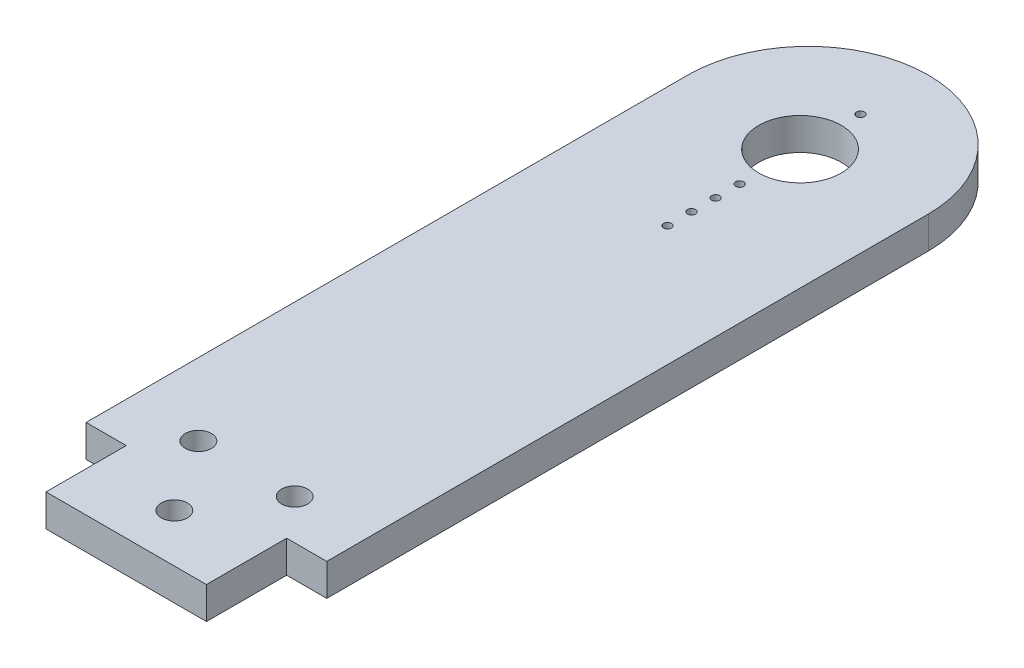
ISO-10303-21;
HEADER;
FILE_DESCRIPTION(('STEP AP214'),'2;1');
FILE_NAME('part.step','',(''),(''),'','','');
FILE_SCHEMA(('AUTOMOTIVE_DESIGN { 1 0 10303 214 1 1 1 1 }'));
ENDSEC;
DATA;
#1=APPLICATION_CONTEXT('core data for automotive mechanical design processes');
#2=APPLICATION_PROTOCOL_DEFINITION('international standard','automotive_design',2000,#1);
#3=PRODUCT_CONTEXT('',#1,'mechanical');
#4=PRODUCT('Part','Part','',(#3));
#5=PRODUCT_RELATED_PRODUCT_CATEGORY('part','',(#4));
#6=PRODUCT_DEFINITION_FORMATION('','',#4);
#7=PRODUCT_DEFINITION_CONTEXT('part definition',#1,'design');
#8=PRODUCT_DEFINITION('design','',#6,#7);
#9=PRODUCT_DEFINITION_SHAPE('','',#8);
#10=(LENGTH_UNIT() NAMED_UNIT(*) SI_UNIT(.MILLI.,.METRE.));
#11=(NAMED_UNIT(*) PLANE_ANGLE_UNIT() SI_UNIT($,.RADIAN.));
#12=(NAMED_UNIT(*) SI_UNIT($,.STERADIAN.) SOLID_ANGLE_UNIT());
#13=UNCERTAINTY_MEASURE_WITH_UNIT(LENGTH_MEASURE(1.E-05),#10,'distance_accuracy_value','');
#14=(GEOMETRIC_REPRESENTATION_CONTEXT(3) GLOBAL_UNCERTAINTY_ASSIGNED_CONTEXT((#13)) GLOBAL_UNIT_ASSIGNED_CONTEXT((#10,
#11,#12)) REPRESENTATION_CONTEXT('',''));
#15=CARTESIAN_POINT('',(0.,0.,0.));
#16=DIRECTION('',(0.,0.,1.));
#17=DIRECTION('',(1.,0.,0.));
#18=AXIS2_PLACEMENT_3D('',#15,#16,#17);
#19=CARTESIAN_POINT('',(0.,4.,0.));
#20=DIRECTION('',(0.,-1.,0.));
#21=DIRECTION('',(0.,0.,-1.));
#22=AXIS2_PLACEMENT_3D('',#19,#20,#21);
#23=PLANE('',#22);
#24=CARTESIAN_POINT('',(0.,4.,-91.53));
#25=DIRECTION('',(0.,1.,0.));
#26=DIRECTION('',(0.,0.,1.));
#27=AXIS2_PLACEMENT_3D('',#24,#25,#26);
#28=CIRCLE('',#27,0.5);
#29=CARTESIAN_POINT('',(0.,4.,-91.03));
#30=VERTEX_POINT('',#29);
#31=EDGE_CURVE('E319',#30,#30,#28,.T.);
#32=ORIENTED_EDGE('',*,*,#31,.F.);
#33=EDGE_LOOP('',(#32));
#34=FACE_BOUND('',#33,.T.);
#35=CARTESIAN_POINT('',(0.,4.,-67.47));
#36=DIRECTION('',(0.,1.,0.));
#37=DIRECTION('',(0.,0.,1.));
#38=AXIS2_PLACEMENT_3D('',#35,#36,#37);
#39=CIRCLE('',#38,0.5);
#40=CARTESIAN_POINT('',(0.,4.,-66.97));
#41=VERTEX_POINT('',#40);
#42=EDGE_CURVE('E321',#41,#41,#39,.T.);
#43=ORIENTED_EDGE('',*,*,#42,.F.);
#44=EDGE_LOOP('',(#43));
#45=FACE_BOUND('',#44,.T.);
#46=CARTESIAN_POINT('',(0.,4.,-70.47));
#47=DIRECTION('',(0.,1.,0.));
#48=DIRECTION('',(0.,0.,1.));
#49=AXIS2_PLACEMENT_3D('',#46,#47,#48);
#50=CIRCLE('',#49,0.5);
#51=CARTESIAN_POINT('',(0.,4.,-69.97));
#52=VERTEX_POINT('',#51);
#53=EDGE_CURVE('E327',#52,#52,#50,.T.);
#54=ORIENTED_EDGE('',*,*,#53,.F.);
#55=EDGE_LOOP('',(#54));
#56=FACE_BOUND('',#55,.T.);
#57=CARTESIAN_POINT('',(0.,4.,-73.47));
#58=DIRECTION('',(0.,1.,0.));
#59=DIRECTION('',(0.,0.,1.));
#60=AXIS2_PLACEMENT_3D('',#57,#58,#59);
#61=CIRCLE('',#60,0.5);
#62=CARTESIAN_POINT('',(0.,4.,-72.97));
#63=VERTEX_POINT('',#62);
#64=EDGE_CURVE('E215',#63,#63,#61,.T.);
#65=ORIENTED_EDGE('',*,*,#64,.F.);
#66=EDGE_LOOP('',(#65));
#67=FACE_BOUND('',#66,.T.);
#68=CARTESIAN_POINT('',(0.,4.,-76.47));
#69=DIRECTION('',(0.,1.,0.));
#70=DIRECTION('',(0.,0.,1.));
#71=AXIS2_PLACEMENT_3D('',#68,#69,#70);
#72=CIRCLE('',#71,0.5);
#73=CARTESIAN_POINT('',(0.,4.,-75.97));
#74=VERTEX_POINT('',#73);
#75=EDGE_CURVE('E207',#74,#74,#72,.T.);
#76=ORIENTED_EDGE('',*,*,#75,.F.);
#77=EDGE_LOOP('',(#76));
#78=FACE_BOUND('',#77,.T.);
#79=CARTESIAN_POINT('',(6.,4.,-15.));
#80=DIRECTION('',(0.,1.,0.));
#81=DIRECTION('',(0.,0.,-1.));
#82=AXIS2_PLACEMENT_3D('',#79,#80,#81);
#83=CIRCLE('',#82,1.625);
#84=CARTESIAN_POINT('',(6.,4.,-16.625));
#85=VERTEX_POINT('',#84);
#86=EDGE_CURVE('E221',#85,#85,#83,.T.);
#87=ORIENTED_EDGE('',*,*,#86,.F.);
#88=EDGE_LOOP('',(#87));
#89=FACE_BOUND('',#88,.T.);
#90=CARTESIAN_POINT('',(-6.,4.,-15.));
#91=DIRECTION('',(0.,1.,0.));
#92=DIRECTION('',(0.,0.,1.));
#93=AXIS2_PLACEMENT_3D('',#90,#91,#92);
#94=CIRCLE('',#93,1.625);
#95=CARTESIAN_POINT('',(-6.,4.,-13.375));
#96=VERTEX_POINT('',#95);
#97=EDGE_CURVE('E160',#96,#96,#94,.T.);
#98=ORIENTED_EDGE('',*,*,#97,.F.);
#99=EDGE_LOOP('',(#98));
#100=FACE_BOUND('',#99,.T.);
#101=DIRECTION('',(0.,0.,-1.));
#102=VECTOR('',#101,1.);
#103=CARTESIAN_POINT('',(15.,4.,-10.));
#104=LINE('',#103,#102);
#105=CARTESIAN_POINT('',(15.,4.,-10.));
#106=VERTEX_POINT('',#105);
#107=CARTESIAN_POINT('',(15.,4.,-85.));
#108=VERTEX_POINT('',#107);
#109=EDGE_CURVE('E112',#106,#108,#104,.T.);
#110=ORIENTED_EDGE('',*,*,#109,.T.);
#111=CARTESIAN_POINT('',(0.,4.,-85.));
#112=DIRECTION('',(0.,-1.,0.));
#113=DIRECTION('',(0.,0.,-1.));
#114=AXIS2_PLACEMENT_3D('',#111,#112,#113);
#115=CIRCLE('',#114,15.);
#116=CARTESIAN_POINT('',(0.,4.,-100.));
#117=VERTEX_POINT('',#116);
#118=EDGE_CURVE('E44',#108,#117,#115,.F.);
#119=ORIENTED_EDGE('',*,*,#118,.T.);
#120=CARTESIAN_POINT('',(0.,4.,-85.));
#121=DIRECTION('',(0.,-1.,0.));
#122=DIRECTION('',(0.,0.,-1.));
#123=AXIS2_PLACEMENT_3D('',#120,#121,#122);
#124=CIRCLE('',#123,15.);
#125=CARTESIAN_POINT('',(-15.,4.,-85.));
#126=VERTEX_POINT('',#125);
#127=EDGE_CURVE('E51',#117,#126,#124,.F.);
#128=ORIENTED_EDGE('',*,*,#127,.T.);
#129=DIRECTION('',(0.,0.,1.));
#130=VECTOR('',#129,1.);
#131=CARTESIAN_POINT('',(-15.,4.,-100.));
#132=LINE('',#131,#130);
#133=CARTESIAN_POINT('',(-15.,4.,-10.));
#134=VERTEX_POINT('',#133);
#135=EDGE_CURVE('E148',#126,#134,#132,.T.);
#136=ORIENTED_EDGE('',*,*,#135,.T.);
#137=DIRECTION('',(1.,0.,0.));
#138=VECTOR('',#137,1.);
#139=CARTESIAN_POINT('',(-15.,4.,-10.));
#140=LINE('',#139,#138);
#141=CARTESIAN_POINT('',(-10.,4.,-10.));
#142=VERTEX_POINT('',#141);
#143=EDGE_CURVE('E150',#134,#142,#140,.T.);
#144=ORIENTED_EDGE('',*,*,#143,.T.);
#145=DIRECTION('',(0.,0.,1.));
#146=VECTOR('',#145,1.);
#147=CARTESIAN_POINT('',(-10.,4.,-10.));
#148=LINE('',#147,#146);
#149=CARTESIAN_POINT('',(-10.,4.,0.));
#150=VERTEX_POINT('',#149);
#151=EDGE_CURVE('E154',#142,#150,#148,.T.);
#152=ORIENTED_EDGE('',*,*,#151,.T.);
#153=DIRECTION('',(1.,0.,0.));
#154=VECTOR('',#153,1.);
#155=CARTESIAN_POINT('',(-10.,4.,0.));
#156=LINE('',#155,#154);
#157=CARTESIAN_POINT('',(10.,4.,0.));
#158=VERTEX_POINT('',#157);
#159=EDGE_CURVE('E118',#150,#158,#156,.T.);
#160=ORIENTED_EDGE('',*,*,#159,.T.);
#161=DIRECTION('',(0.,0.,-1.));
#162=VECTOR('',#161,1.);
#163=CARTESIAN_POINT('',(10.,4.,0.));
#164=LINE('',#163,#162);
#165=CARTESIAN_POINT('',(10.,4.,-10.));
#166=VERTEX_POINT('',#165);
#167=EDGE_CURVE('E113',#158,#166,#164,.T.);
#168=ORIENTED_EDGE('',*,*,#167,.T.);
#169=DIRECTION('',(1.,0.,0.));
#170=VECTOR('',#169,1.);
#171=CARTESIAN_POINT('',(10.,4.,-10.));
#172=LINE('',#171,#170);
#173=EDGE_CURVE('E103',#166,#106,#172,.T.);
#174=ORIENTED_EDGE('',*,*,#173,.T.);
#175=EDGE_LOOP('',(#110,#119,#128,#136,#144,#152,#160,#168,#174));
#176=FACE_BOUND('',#175,.T.);
#177=CARTESIAN_POINT('',(0.,4.,-6.));
#178=DIRECTION('',(0.,1.,0.));
#179=DIRECTION('',(0.,0.,1.));
#180=AXIS2_PLACEMENT_3D('',#177,#178,#179);
#181=CIRCLE('',#180,1.625);
#182=CARTESIAN_POINT('',(0.,4.,-4.375));
#183=VERTEX_POINT('',#182);
#184=EDGE_CURVE('E227',#183,#183,#181,.T.);
#185=ORIENTED_EDGE('',*,*,#184,.F.);
#186=EDGE_LOOP('',(#185));
#187=FACE_BOUND('',#186,.T.);
#188=CARTESIAN_POINT('',(0.,4.,-84.));
#189=DIRECTION('',(0.,1.,0.));
#190=DIRECTION('',(0.,0.,1.));
#191=AXIS2_PLACEMENT_3D('',#188,#189,#190);
#192=CIRCLE('',#191,5.15);
#193=CARTESIAN_POINT('',(0.,4.,-78.85));
#194=VERTEX_POINT('',#193);
#195=EDGE_CURVE('E204',#194,#194,#192,.T.);
#196=ORIENTED_EDGE('',*,*,#195,.F.);
#197=EDGE_LOOP('',(#196));
#198=FACE_BOUND('',#197,.T.);
#199=ADVANCED_FACE('F35',(#34,#45,#56,#67,#78,#89,#100,#176,#187,#198),#23,.F.);
#200=CARTESIAN_POINT('',(0.,0.,0.));
#201=DIRECTION('',(0.,-1.,0.));
#202=DIRECTION('',(0.,0.,-1.));
#203=AXIS2_PLACEMENT_3D('',#200,#201,#202);
#204=PLANE('',#203);
#205=CARTESIAN_POINT('',(0.,0.,-91.53));
#206=DIRECTION('',(0.,1.,0.));
#207=DIRECTION('',(0.,0.,1.));
#208=AXIS2_PLACEMENT_3D('',#205,#206,#207);
#209=CIRCLE('',#208,0.5);
#210=CARTESIAN_POINT('',(0.,0.,-91.03));
#211=VERTEX_POINT('',#210);
#212=EDGE_CURVE('E317',#211,#211,#209,.T.);
#213=ORIENTED_EDGE('',*,*,#212,.T.);
#214=EDGE_LOOP('',(#213));
#215=FACE_BOUND('',#214,.T.);
#216=CARTESIAN_POINT('',(0.,0.,-67.47));
#217=DIRECTION('',(0.,1.,0.));
#218=DIRECTION('',(0.,0.,1.));
#219=AXIS2_PLACEMENT_3D('',#216,#217,#218);
#220=CIRCLE('',#219,0.5);
#221=CARTESIAN_POINT('',(0.,0.,-66.97));
#222=VERTEX_POINT('',#221);
#223=EDGE_CURVE('E324',#222,#222,#220,.T.);
#224=ORIENTED_EDGE('',*,*,#223,.T.);
#225=EDGE_LOOP('',(#224));
#226=FACE_BOUND('',#225,.T.);
#227=CARTESIAN_POINT('',(0.,0.,-70.47));
#228=DIRECTION('',(0.,1.,0.));
#229=DIRECTION('',(0.,0.,1.));
#230=AXIS2_PLACEMENT_3D('',#227,#228,#229);
#231=CIRCLE('',#230,0.5);
#232=CARTESIAN_POINT('',(0.,0.,-69.97));
#233=VERTEX_POINT('',#232);
#234=EDGE_CURVE('E330',#233,#233,#231,.T.);
#235=ORIENTED_EDGE('',*,*,#234,.T.);
#236=EDGE_LOOP('',(#235));
#237=FACE_BOUND('',#236,.T.);
#238=CARTESIAN_POINT('',(0.,0.,-73.47));
#239=DIRECTION('',(0.,1.,0.));
#240=DIRECTION('',(0.,0.,1.));
#241=AXIS2_PLACEMENT_3D('',#238,#239,#240);
#242=CIRCLE('',#241,0.5);
#243=CARTESIAN_POINT('',(0.,0.,-72.97));
#244=VERTEX_POINT('',#243);
#245=EDGE_CURVE('E212',#244,#244,#242,.T.);
#246=ORIENTED_EDGE('',*,*,#245,.T.);
#247=EDGE_LOOP('',(#246));
#248=FACE_BOUND('',#247,.T.);
#249=CARTESIAN_POINT('',(0.,0.,-76.47));
#250=DIRECTION('',(0.,1.,0.));
#251=DIRECTION('',(0.,0.,1.));
#252=AXIS2_PLACEMENT_3D('',#249,#250,#251);
#253=CIRCLE('',#252,0.5);
#254=CARTESIAN_POINT('',(0.,0.,-75.97));
#255=VERTEX_POINT('',#254);
#256=EDGE_CURVE('E202',#255,#255,#253,.T.);
#257=ORIENTED_EDGE('',*,*,#256,.T.);
#258=EDGE_LOOP('',(#257));
#259=FACE_BOUND('',#258,.T.);
#260=CARTESIAN_POINT('',(6.,0.,-15.));
#261=DIRECTION('',(0.,1.,0.));
#262=DIRECTION('',(0.,0.,-1.));
#263=AXIS2_PLACEMENT_3D('',#260,#261,#262);
#264=CIRCLE('',#263,1.625);
#265=CARTESIAN_POINT('',(6.,0.,-16.625));
#266=VERTEX_POINT('',#265);
#267=EDGE_CURVE('E219',#266,#266,#264,.T.);
#268=ORIENTED_EDGE('',*,*,#267,.T.);
#269=EDGE_LOOP('',(#268));
#270=FACE_BOUND('',#269,.T.);
#271=CARTESIAN_POINT('',(-6.,0.,-15.));
#272=DIRECTION('',(0.,1.,0.));
#273=DIRECTION('',(0.,0.,1.));
#274=AXIS2_PLACEMENT_3D('',#271,#272,#273);
#275=CIRCLE('',#274,1.625);
#276=CARTESIAN_POINT('',(-6.,0.,-13.375));
#277=VERTEX_POINT('',#276);
#278=EDGE_CURVE('E230',#277,#277,#275,.T.);
#279=ORIENTED_EDGE('',*,*,#278,.T.);
#280=EDGE_LOOP('',(#279));
#281=FACE_BOUND('',#280,.T.);
#282=CARTESIAN_POINT('',(0.,0.,-85.));
#283=DIRECTION('',(0.,-1.,0.));
#284=DIRECTION('',(0.,0.,-1.));
#285=AXIS2_PLACEMENT_3D('',#282,#283,#284);
#286=CIRCLE('',#285,15.);
#287=CARTESIAN_POINT('',(-15.,0.,-85.));
#288=VERTEX_POINT('',#287);
#289=CARTESIAN_POINT('',(0.,0.,-100.));
#290=VERTEX_POINT('',#289);
#291=EDGE_CURVE('E127',#288,#290,#286,.T.);
#292=ORIENTED_EDGE('',*,*,#291,.T.);
#293=CARTESIAN_POINT('',(0.,0.,-85.));
#294=DIRECTION('',(0.,-1.,0.));
#295=DIRECTION('',(0.,0.,-1.));
#296=AXIS2_PLACEMENT_3D('',#293,#294,#295);
#297=CIRCLE('',#296,15.);
#298=CARTESIAN_POINT('',(15.,0.,-85.));
#299=VERTEX_POINT('',#298);
#300=EDGE_CURVE('E129',#290,#299,#297,.T.);
#301=ORIENTED_EDGE('',*,*,#300,.T.);
#302=DIRECTION('',(0.,0.,-1.));
#303=VECTOR('',#302,1.);
#304=CARTESIAN_POINT('',(15.,0.,-10.));
#305=LINE('',#304,#303);
#306=CARTESIAN_POINT('',(15.,0.,-10.));
#307=VERTEX_POINT('',#306);
#308=EDGE_CURVE('E145',#307,#299,#305,.T.);
#309=ORIENTED_EDGE('',*,*,#308,.F.);
#310=DIRECTION('',(1.,0.,0.));
#311=VECTOR('',#310,1.);
#312=CARTESIAN_POINT('',(10.,0.,-10.));
#313=LINE('',#312,#311);
#314=CARTESIAN_POINT('',(10.,0.,-10.));
#315=VERTEX_POINT('',#314);
#316=EDGE_CURVE('E159',#315,#307,#313,.T.);
#317=ORIENTED_EDGE('',*,*,#316,.F.);
#318=DIRECTION('',(0.,0.,-1.));
#319=VECTOR('',#318,1.);
#320=CARTESIAN_POINT('',(10.,0.,0.));
#321=LINE('',#320,#319);
#322=CARTESIAN_POINT('',(10.,0.,0.));
#323=VERTEX_POINT('',#322);
#324=EDGE_CURVE('E126',#323,#315,#321,.T.);
#325=ORIENTED_EDGE('',*,*,#324,.F.);
#326=DIRECTION('',(1.,0.,0.));
#327=VECTOR('',#326,1.);
#328=CARTESIAN_POINT('',(-10.,0.,0.));
#329=LINE('',#328,#327);
#330=CARTESIAN_POINT('',(-10.,0.,0.));
#331=VERTEX_POINT('',#330);
#332=EDGE_CURVE('E122',#331,#323,#329,.T.);
#333=ORIENTED_EDGE('',*,*,#332,.F.);
#334=DIRECTION('',(0.,0.,1.));
#335=VECTOR('',#334,1.);
#336=CARTESIAN_POINT('',(-10.,0.,-10.));
#337=LINE('',#336,#335);
#338=CARTESIAN_POINT('',(-10.,0.,-10.));
#339=VERTEX_POINT('',#338);
#340=EDGE_CURVE('E167',#339,#331,#337,.T.);
#341=ORIENTED_EDGE('',*,*,#340,.F.);
#342=DIRECTION('',(1.,0.,0.));
#343=VECTOR('',#342,1.);
#344=CARTESIAN_POINT('',(-15.,0.,-10.));
#345=LINE('',#344,#343);
#346=CARTESIAN_POINT('',(-15.,0.,-10.));
#347=VERTEX_POINT('',#346);
#348=EDGE_CURVE('E165',#347,#339,#345,.T.);
#349=ORIENTED_EDGE('',*,*,#348,.F.);
#350=DIRECTION('',(0.,0.,1.));
#351=VECTOR('',#350,1.);
#352=CARTESIAN_POINT('',(-15.,0.,-100.));
#353=LINE('',#352,#351);
#354=EDGE_CURVE('E163',#288,#347,#353,.T.);
#355=ORIENTED_EDGE('',*,*,#354,.F.);
#356=EDGE_LOOP('',(#292,#301,#309,#317,#325,#333,#341,#349,#355));
#357=FACE_BOUND('',#356,.T.);
#358=CARTESIAN_POINT('',(0.,0.,-6.));
#359=DIRECTION('',(0.,1.,0.));
#360=DIRECTION('',(0.,0.,1.));
#361=AXIS2_PLACEMENT_3D('',#358,#359,#360);
#362=CIRCLE('',#361,1.625);
#363=CARTESIAN_POINT('',(0.,0.,-4.375));
#364=VERTEX_POINT('',#363);
#365=EDGE_CURVE('E224',#364,#364,#362,.T.);
#366=ORIENTED_EDGE('',*,*,#365,.T.);
#367=EDGE_LOOP('',(#366));
#368=FACE_BOUND('',#367,.T.);
#369=CARTESIAN_POINT('',(0.,0.,-84.));
#370=DIRECTION('',(0.,1.,0.));
#371=DIRECTION('',(0.,0.,1.));
#372=AXIS2_PLACEMENT_3D('',#369,#370,#371);
#373=CIRCLE('',#372,5.15);
#374=CARTESIAN_POINT('',(0.,0.,-78.85));
#375=VERTEX_POINT('',#374);
#376=EDGE_CURVE('E201',#375,#375,#373,.T.);
#377=ORIENTED_EDGE('',*,*,#376,.T.);
#378=EDGE_LOOP('',(#377));
#379=FACE_BOUND('',#378,.T.);
#380=ADVANCED_FACE('F187',(#215,#226,#237,#248,#259,#270,#281,#357,#368,#379),#204,.T.);
#381=CARTESIAN_POINT('',(10.,4.,0.));
#382=DIRECTION('',(-1.,0.,0.));
#383=DIRECTION('',(0.,0.,1.));
#384=AXIS2_PLACEMENT_3D('',#381,#382,#383);
#385=PLANE('',#384);
#386=ORIENTED_EDGE('',*,*,#324,.T.);
#387=DIRECTION('',(0.,-1.,0.));
#388=VECTOR('',#387,1.);
#389=CARTESIAN_POINT('',(10.,4.,-10.));
#390=LINE('',#389,#388);
#391=EDGE_CURVE('E107',#166,#315,#390,.T.);
#392=ORIENTED_EDGE('',*,*,#391,.F.);
#393=ORIENTED_EDGE('',*,*,#167,.F.);
#394=DIRECTION('',(0.,-1.,0.));
#395=VECTOR('',#394,1.);
#396=CARTESIAN_POINT('',(10.,4.,0.));
#397=LINE('',#396,#395);
#398=EDGE_CURVE('E157',#158,#323,#397,.T.);
#399=ORIENTED_EDGE('',*,*,#398,.T.);
#400=EDGE_LOOP('',(#386,#392,#393,#399));
#401=FACE_BOUND('',#400,.T.);
#402=ADVANCED_FACE('F124',(#401),#385,.F.);
#403=CARTESIAN_POINT('',(10.,4.,-10.));
#404=DIRECTION('',(0.,0.,-1.));
#405=DIRECTION('',(-1.,0.,0.));
#406=AXIS2_PLACEMENT_3D('',#403,#404,#405);
#407=PLANE('',#406);
#408=ORIENTED_EDGE('',*,*,#316,.T.);
#409=DIRECTION('',(0.,-1.,0.));
#410=VECTOR('',#409,1.);
#411=CARTESIAN_POINT('',(15.,4.,-10.));
#412=LINE('',#411,#410);
#413=EDGE_CURVE('E110',#106,#307,#412,.T.);
#414=ORIENTED_EDGE('',*,*,#413,.F.);
#415=ORIENTED_EDGE('',*,*,#173,.F.);
#416=ORIENTED_EDGE('',*,*,#391,.T.);
#417=EDGE_LOOP('',(#408,#414,#415,#416));
#418=FACE_BOUND('',#417,.T.);
#419=ADVANCED_FACE('F105',(#418),#407,.F.);
#420=CARTESIAN_POINT('',(15.,4.,-10.));
#421=DIRECTION('',(-1.,0.,0.));
#422=DIRECTION('',(0.,0.,1.));
#423=AXIS2_PLACEMENT_3D('',#420,#421,#422);
#424=PLANE('',#423);
#425=ORIENTED_EDGE('',*,*,#308,.T.);
#426=DIRECTION('',(0.,-1.,0.));
#427=VECTOR('',#426,1.);
#428=CARTESIAN_POINT('',(15.,4.,-85.));
#429=LINE('',#428,#427);
#430=EDGE_CURVE('E136',#299,#108,#429,.F.);
#431=ORIENTED_EDGE('',*,*,#430,.T.);
#432=ORIENTED_EDGE('',*,*,#109,.F.);
#433=ORIENTED_EDGE('',*,*,#413,.T.);
#434=EDGE_LOOP('',(#425,#431,#432,#433));
#435=FACE_BOUND('',#434,.T.);
#436=ADVANCED_FACE('F143',(#435),#424,.F.);
#437=CARTESIAN_POINT('',(-15.,4.,-100.));
#438=DIRECTION('',(1.,0.,0.));
#439=DIRECTION('',(0.,0.,-1.));
#440=AXIS2_PLACEMENT_3D('',#437,#438,#439);
#441=PLANE('',#440);
#442=ORIENTED_EDGE('',*,*,#135,.F.);
#443=DIRECTION('',(0.,-1.,0.));
#444=VECTOR('',#443,1.);
#445=CARTESIAN_POINT('',(-15.,4.,-85.));
#446=LINE('',#445,#444);
#447=EDGE_CURVE('E11',#126,#288,#446,.T.);
#448=ORIENTED_EDGE('',*,*,#447,.T.);
#449=ORIENTED_EDGE('',*,*,#354,.T.);
#450=DIRECTION('',(0.,-1.,0.));
#451=VECTOR('',#450,1.);
#452=CARTESIAN_POINT('',(-15.,4.,-10.));
#453=LINE('',#452,#451);
#454=EDGE_CURVE('E131',#134,#347,#453,.T.);
#455=ORIENTED_EDGE('',*,*,#454,.F.);
#456=EDGE_LOOP('',(#442,#448,#449,#455));
#457=FACE_BOUND('',#456,.T.);
#458=ADVANCED_FACE('F267',(#457),#441,.F.);
#459=CARTESIAN_POINT('',(-15.,4.,-10.));
#460=DIRECTION('',(0.,0.,-1.));
#461=DIRECTION('',(-1.,0.,0.));
#462=AXIS2_PLACEMENT_3D('',#459,#460,#461);
#463=PLANE('',#462);
#464=ORIENTED_EDGE('',*,*,#348,.T.);
#465=DIRECTION('',(0.,-1.,0.));
#466=VECTOR('',#465,1.);
#467=CARTESIAN_POINT('',(-10.,4.,-10.));
#468=LINE('',#467,#466);
#469=EDGE_CURVE('E174',#142,#339,#468,.T.);
#470=ORIENTED_EDGE('',*,*,#469,.F.);
#471=ORIENTED_EDGE('',*,*,#143,.F.);
#472=ORIENTED_EDGE('',*,*,#454,.T.);
#473=EDGE_LOOP('',(#464,#470,#471,#472));
#474=FACE_BOUND('',#473,.T.);
#475=ADVANCED_FACE('F181',(#474),#463,.F.);
#476=CARTESIAN_POINT('',(-10.,4.,-10.));
#477=DIRECTION('',(1.,0.,0.));
#478=DIRECTION('',(0.,0.,-1.));
#479=AXIS2_PLACEMENT_3D('',#476,#477,#478);
#480=PLANE('',#479);
#481=ORIENTED_EDGE('',*,*,#340,.T.);
#482=DIRECTION('',(0.,-1.,0.));
#483=VECTOR('',#482,1.);
#484=CARTESIAN_POINT('',(-10.,4.,0.));
#485=LINE('',#484,#483);
#486=EDGE_CURVE('E171',#150,#331,#485,.T.);
#487=ORIENTED_EDGE('',*,*,#486,.F.);
#488=ORIENTED_EDGE('',*,*,#151,.F.);
#489=ORIENTED_EDGE('',*,*,#469,.T.);
#490=EDGE_LOOP('',(#481,#487,#488,#489));
#491=FACE_BOUND('',#490,.T.);
#492=ADVANCED_FACE('F193',(#491),#480,.F.);
#493=CARTESIAN_POINT('',(-10.,4.,0.));
#494=DIRECTION('',(0.,0.,-1.));
#495=DIRECTION('',(-1.,0.,0.));
#496=AXIS2_PLACEMENT_3D('',#493,#494,#495);
#497=PLANE('',#496);
#498=ORIENTED_EDGE('',*,*,#332,.T.);
#499=ORIENTED_EDGE('',*,*,#398,.F.);
#500=ORIENTED_EDGE('',*,*,#159,.F.);
#501=ORIENTED_EDGE('',*,*,#486,.T.);
#502=EDGE_LOOP('',(#498,#499,#500,#501));
#503=FACE_BOUND('',#502,.T.);
#504=ADVANCED_FACE('F196',(#503),#497,.F.);
#505=CARTESIAN_POINT('',(-6.,4.,-15.));
#506=DIRECTION('',(0.,-1.,0.));
#507=DIRECTION('',(0.,0.,-1.));
#508=AXIS2_PLACEMENT_3D('',#505,#506,#507);
#509=CYLINDRICAL_SURFACE('',#508,1.625);
#510=ORIENTED_EDGE('',*,*,#97,.T.);
#511=EDGE_LOOP('',(#510));
#512=FACE_BOUND('',#511,.T.);
#513=ORIENTED_EDGE('',*,*,#278,.F.);
#514=EDGE_LOOP('',(#513));
#515=FACE_BOUND('',#514,.T.);
#516=ADVANCED_FACE('F239',(#512,#515),#509,.F.);
#517=CARTESIAN_POINT('',(0.,4.,-6.));
#518=DIRECTION('',(0.,-1.,0.));
#519=DIRECTION('',(0.,0.,-1.));
#520=AXIS2_PLACEMENT_3D('',#517,#518,#519);
#521=CYLINDRICAL_SURFACE('',#520,1.625);
#522=ORIENTED_EDGE('',*,*,#184,.T.);
#523=EDGE_LOOP('',(#522));
#524=FACE_BOUND('',#523,.T.);
#525=ORIENTED_EDGE('',*,*,#365,.F.);
#526=EDGE_LOOP('',(#525));
#527=FACE_BOUND('',#526,.T.);
#528=ADVANCED_FACE('F241',(#524,#527),#521,.F.);
#529=CARTESIAN_POINT('',(6.,4.,-15.));
#530=DIRECTION('',(0.,-1.,0.));
#531=DIRECTION('',(0.,0.,-1.));
#532=AXIS2_PLACEMENT_3D('',#529,#530,#531);
#533=CYLINDRICAL_SURFACE('',#532,1.625);
#534=ORIENTED_EDGE('',*,*,#86,.T.);
#535=EDGE_LOOP('',(#534));
#536=FACE_BOUND('',#535,.T.);
#537=ORIENTED_EDGE('',*,*,#267,.F.);
#538=EDGE_LOOP('',(#537));
#539=FACE_BOUND('',#538,.T.);
#540=ADVANCED_FACE('F248',(#536,#539),#533,.F.);
#541=CARTESIAN_POINT('',(0.,4.,-84.));
#542=DIRECTION('',(0.,-1.,0.));
#543=DIRECTION('',(0.,0.,-1.));
#544=AXIS2_PLACEMENT_3D('',#541,#542,#543);
#545=CYLINDRICAL_SURFACE('',#544,5.15);
#546=ORIENTED_EDGE('',*,*,#195,.T.);
#547=EDGE_LOOP('',(#546));
#548=FACE_BOUND('',#547,.T.);
#549=ORIENTED_EDGE('',*,*,#376,.F.);
#550=EDGE_LOOP('',(#549));
#551=FACE_BOUND('',#550,.T.);
#552=ADVANCED_FACE('F284',(#548,#551),#545,.F.);
#553=CARTESIAN_POINT('',(0.,4.,-85.));
#554=DIRECTION('',(0.,-1.,0.));
#555=DIRECTION('',(0.,0.,-1.));
#556=AXIS2_PLACEMENT_3D('',#553,#554,#555);
#557=CYLINDRICAL_SURFACE('',#556,15.);
#558=ORIENTED_EDGE('',*,*,#447,.F.);
#559=ORIENTED_EDGE('',*,*,#127,.F.);
#560=DIRECTION('',(0.,-1.,0.));
#561=VECTOR('',#560,1.);
#562=CARTESIAN_POINT('',(0.,4.,-100.));
#563=LINE('',#562,#561);
#564=EDGE_CURVE('E39',#290,#117,#563,.F.);
#565=ORIENTED_EDGE('',*,*,#564,.F.);
#566=ORIENTED_EDGE('',*,*,#291,.F.);
#567=EDGE_LOOP('',(#558,#559,#565,#566));
#568=FACE_BOUND('',#567,.T.);
#569=ADVANCED_FACE('F37',(#568),#557,.T.);
#570=CARTESIAN_POINT('',(0.,4.,-85.));
#571=DIRECTION('',(0.,-1.,0.));
#572=DIRECTION('',(0.,0.,-1.));
#573=AXIS2_PLACEMENT_3D('',#570,#571,#572);
#574=CYLINDRICAL_SURFACE('',#573,15.);
#575=ORIENTED_EDGE('',*,*,#118,.F.);
#576=ORIENTED_EDGE('',*,*,#430,.F.);
#577=ORIENTED_EDGE('',*,*,#300,.F.);
#578=ORIENTED_EDGE('',*,*,#564,.T.);
#579=EDGE_LOOP('',(#575,#576,#577,#578));
#580=FACE_BOUND('',#579,.T.);
#581=ADVANCED_FACE('F199',(#580),#574,.T.);
#582=CARTESIAN_POINT('',(0.,0.,-76.47));
#583=DIRECTION('',(0.,1.,0.));
#584=DIRECTION('',(0.,0.,1.));
#585=AXIS2_PLACEMENT_3D('',#582,#583,#584);
#586=CYLINDRICAL_SURFACE('',#585,0.5);
#587=ORIENTED_EDGE('',*,*,#256,.F.);
#588=EDGE_LOOP('',(#587));
#589=FACE_BOUND('',#588,.T.);
#590=ORIENTED_EDGE('',*,*,#75,.T.);
#591=EDGE_LOOP('',(#590));
#592=FACE_BOUND('',#591,.T.);
#593=ADVANCED_FACE('F276',(#589,#592),#586,.F.);
#594=CARTESIAN_POINT('',(0.,0.,-73.47));
#595=DIRECTION('',(0.,1.,0.));
#596=DIRECTION('',(0.,0.,1.));
#597=AXIS2_PLACEMENT_3D('',#594,#595,#596);
#598=CYLINDRICAL_SURFACE('',#597,0.5);
#599=ORIENTED_EDGE('',*,*,#245,.F.);
#600=EDGE_LOOP('',(#599));
#601=FACE_BOUND('',#600,.T.);
#602=ORIENTED_EDGE('',*,*,#64,.T.);
#603=EDGE_LOOP('',(#602));
#604=FACE_BOUND('',#603,.T.);
#605=ADVANCED_FACE('F281',(#601,#604),#598,.F.);
#606=CARTESIAN_POINT('',(0.,0.,-70.47));
#607=DIRECTION('',(0.,1.,0.));
#608=DIRECTION('',(0.,0.,1.));
#609=AXIS2_PLACEMENT_3D('',#606,#607,#608);
#610=CYLINDRICAL_SURFACE('',#609,0.5);
#611=ORIENTED_EDGE('',*,*,#234,.F.);
#612=EDGE_LOOP('',(#611));
#613=FACE_BOUND('',#612,.T.);
#614=ORIENTED_EDGE('',*,*,#53,.T.);
#615=EDGE_LOOP('',(#614));
#616=FACE_BOUND('',#615,.T.);
#617=ADVANCED_FACE('F300',(#613,#616),#610,.F.);
#618=CARTESIAN_POINT('',(0.,0.,-67.47));
#619=DIRECTION('',(0.,1.,0.));
#620=DIRECTION('',(0.,0.,1.));
#621=AXIS2_PLACEMENT_3D('',#618,#619,#620);
#622=CYLINDRICAL_SURFACE('',#621,0.5);
#623=ORIENTED_EDGE('',*,*,#223,.F.);
#624=EDGE_LOOP('',(#623));
#625=FACE_BOUND('',#624,.T.);
#626=ORIENTED_EDGE('',*,*,#42,.T.);
#627=EDGE_LOOP('',(#626));
#628=FACE_BOUND('',#627,.T.);
#629=ADVANCED_FACE('F304',(#625,#628),#622,.F.);
#630=CARTESIAN_POINT('',(0.,0.,-91.53));
#631=DIRECTION('',(0.,1.,0.));
#632=DIRECTION('',(0.,0.,1.));
#633=AXIS2_PLACEMENT_3D('',#630,#631,#632);
#634=CYLINDRICAL_SURFACE('',#633,0.5);
#635=ORIENTED_EDGE('',*,*,#212,.F.);
#636=EDGE_LOOP('',(#635));
#637=FACE_BOUND('',#636,.T.);
#638=ORIENTED_EDGE('',*,*,#31,.T.);
#639=EDGE_LOOP('',(#638));
#640=FACE_BOUND('',#639,.T.);
#641=ADVANCED_FACE('F308',(#637,#640),#634,.F.);
#642=CLOSED_SHELL('',(#199,#380,#402,#419,#436,#458,#475,#492,#504,#516,#528,#540,#552,#569,
#581,#593,#605,#617,#629,#641));
#643=MANIFOLD_SOLID_BREP('B2',#642);
#644=ADVANCED_BREP_SHAPE_REPRESENTATION('',(#18,#643),#14);
#645=SHAPE_DEFINITION_REPRESENTATION(#9,#644);
ENDSEC;
END-ISO-10303-21;
